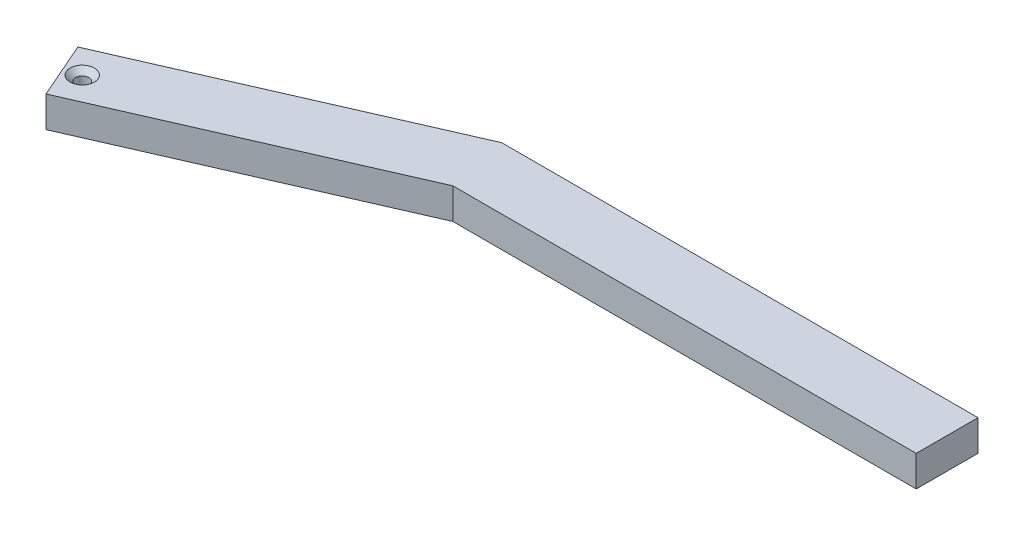
ISO-10303-21;
HEADER;
FILE_DESCRIPTION(('STEP AP214'),'2;1');
FILE_NAME('part.step','',(''),(''),'','','');
FILE_SCHEMA(('AUTOMOTIVE_DESIGN { 1 0 10303 214 1 1 1 1 }'));
ENDSEC;
DATA;
#1=APPLICATION_CONTEXT('core data for automotive mechanical design processes');
#2=APPLICATION_PROTOCOL_DEFINITION('international standard','automotive_design',2000,#1);
#3=PRODUCT_CONTEXT('',#1,'mechanical');
#4=PRODUCT('Part','Part','',(#3));
#5=PRODUCT_RELATED_PRODUCT_CATEGORY('part','',(#4));
#6=PRODUCT_DEFINITION_FORMATION('','',#4);
#7=PRODUCT_DEFINITION_CONTEXT('part definition',#1,'design');
#8=PRODUCT_DEFINITION('design','',#6,#7);
#9=PRODUCT_DEFINITION_SHAPE('','',#8);
#10=(LENGTH_UNIT() NAMED_UNIT(*) SI_UNIT(.MILLI.,.METRE.));
#11=(NAMED_UNIT(*) PLANE_ANGLE_UNIT() SI_UNIT($,.RADIAN.));
#12=(NAMED_UNIT(*) SI_UNIT($,.STERADIAN.) SOLID_ANGLE_UNIT());
#13=UNCERTAINTY_MEASURE_WITH_UNIT(LENGTH_MEASURE(1.E-05),#10,'distance_accuracy_value','');
#14=(GEOMETRIC_REPRESENTATION_CONTEXT(3) GLOBAL_UNCERTAINTY_ASSIGNED_CONTEXT((#13)) GLOBAL_UNIT_ASSIGNED_CONTEXT((#10,
#11,#12)) REPRESENTATION_CONTEXT('',''));
#15=CARTESIAN_POINT('',(0.,0.,0.));
#16=DIRECTION('',(0.,0.,1.));
#17=DIRECTION('',(1.,0.,0.));
#18=AXIS2_PLACEMENT_3D('',#15,#16,#17);
#19=CARTESIAN_POINT('',(20.3717259608542,25.4,46.5363597778754));
#20=DIRECTION('',(0.916070074367626,0.,-0.40101822757587));
#21=DIRECTION('',(-0.40101822757587,0.,-0.916070074367626));
#22=AXIS2_PLACEMENT_3D('',#19,#20,#21);
#23=PLANE('',#22);
#24=DIRECTION('',(0.40101822757587,0.,0.916070074367626));
#25=VECTOR('',#24,1.);
#26=CARTESIAN_POINT('',(20.3717259608542,0.,46.5363597778754));
#27=LINE('',#26,#25);
#28=CARTESIAN_POINT('',(0.,0.,0.));
#29=VERTEX_POINT('',#28);
#30=CARTESIAN_POINT('',(20.3717259608542,0.,46.5363597778754));
#31=VERTEX_POINT('',#30);
#32=EDGE_CURVE('E117',#29,#31,#27,.T.);
#33=ORIENTED_EDGE('',*,*,#32,.T.);
#34=DIRECTION('',(0.,-1.,0.));
#35=VECTOR('',#34,1.);
#36=CARTESIAN_POINT('',(20.3717259608542,25.4,46.5363597778754));
#37=LINE('',#36,#35);
#38=CARTESIAN_POINT('',(20.3717259608542,25.4,46.5363597778754));
#39=VERTEX_POINT('',#38);
#40=EDGE_CURVE('E11',#39,#31,#37,.T.);
#41=ORIENTED_EDGE('',*,*,#40,.F.);
#42=DIRECTION('',(0.40101822757587,0.,0.916070074367626));
#43=VECTOR('',#42,1.);
#44=CARTESIAN_POINT('',(20.3717259608542,25.4,46.5363597778754));
#45=LINE('',#44,#43);
#46=CARTESIAN_POINT('',(0.,25.4,0.));
#47=VERTEX_POINT('',#46);
#48=EDGE_CURVE('E128',#47,#39,#45,.T.);
#49=ORIENTED_EDGE('',*,*,#48,.F.);
#50=DIRECTION('',(0.,-1.,0.));
#51=VECTOR('',#50,1.);
#52=CARTESIAN_POINT('',(0.,25.4,0.));
#53=LINE('',#52,#51);
#54=EDGE_CURVE('E113',#47,#29,#53,.T.);
#55=ORIENTED_EDGE('',*,*,#54,.T.);
#56=EDGE_LOOP('',(#33,#41,#49,#55));
#57=FACE_BOUND('',#56,.T.);
#58=ADVANCED_FACE('F33',(#57),#23,.F.);
#59=CARTESIAN_POINT('',(253.053524850231,25.4,-55.3222700263955));
#60=DIRECTION('',(-0.40101822757587,0.,-0.916070074367626));
#61=DIRECTION('',(-0.916070074367626,0.,0.40101822757587));
#62=AXIS2_PLACEMENT_3D('',#59,#60,#61);
#63=PLANE('',#62);
#64=DIRECTION('',(0.916070074367626,0.,-0.40101822757587));
#65=VECTOR('',#64,1.);
#66=CARTESIAN_POINT('',(253.053524850231,0.,-55.3222700263955));
#67=LINE('',#66,#65);
#68=CARTESIAN_POINT('',(253.053524850231,0.,-55.3222700263955));
#69=VERTEX_POINT('',#68);
#70=EDGE_CURVE('E120',#31,#69,#67,.T.);
#71=ORIENTED_EDGE('',*,*,#70,.T.);
#72=DIRECTION('',(0.,-1.,0.));
#73=VECTOR('',#72,1.);
#74=CARTESIAN_POINT('',(253.053524850231,25.4,-55.3222700263955));
#75=LINE('',#74,#73);
#76=CARTESIAN_POINT('',(253.053524850231,25.4,-55.3222700263955));
#77=VERTEX_POINT('',#76);
#78=EDGE_CURVE('E41',#77,#69,#75,.T.);
#79=ORIENTED_EDGE('',*,*,#78,.F.);
#80=DIRECTION('',(0.916070074367626,0.,-0.40101822757587));
#81=VECTOR('',#80,1.);
#82=CARTESIAN_POINT('',(253.053524850231,25.4,-55.3222700263955));
#83=LINE('',#82,#81);
#84=EDGE_CURVE('E86',#39,#77,#83,.T.);
#85=ORIENTED_EDGE('',*,*,#84,.F.);
#86=ORIENTED_EDGE('',*,*,#40,.T.);
#87=EDGE_LOOP('',(#71,#79,#85,#86));
#88=FACE_BOUND('',#87,.T.);
#89=ADVANCED_FACE('F153',(#88),#63,.F.);
#90=CARTESIAN_POINT('',(634.053524850231,25.4,-55.3222700263956));
#91=DIRECTION('',(0.,0.,-1.));
#92=DIRECTION('',(-1.,0.,0.));
#93=AXIS2_PLACEMENT_3D('',#90,#91,#92);
#94=PLANE('',#93);
#95=DIRECTION('',(1.,0.,0.));
#96=VECTOR('',#95,1.);
#97=CARTESIAN_POINT('',(634.053524850231,0.,-55.3222700263956));
#98=LINE('',#97,#96);
#99=CARTESIAN_POINT('',(634.053524850231,0.,-55.3222700263956));
#100=VERTEX_POINT('',#99);
#101=EDGE_CURVE('E123',#69,#100,#98,.T.);
#102=ORIENTED_EDGE('',*,*,#101,.T.);
#103=DIRECTION('',(0.,-1.,0.));
#104=VECTOR('',#103,1.);
#105=CARTESIAN_POINT('',(634.053524850231,25.4,-55.3222700263956));
#106=LINE('',#105,#104);
#107=CARTESIAN_POINT('',(634.053524850231,25.4,-55.3222700263956));
#108=VERTEX_POINT('',#107);
#109=EDGE_CURVE('E108',#108,#100,#106,.T.);
#110=ORIENTED_EDGE('',*,*,#109,.F.);
#111=DIRECTION('',(1.,0.,0.));
#112=VECTOR('',#111,1.);
#113=CARTESIAN_POINT('',(634.053524850231,25.4,-55.3222700263956));
#114=LINE('',#113,#112);
#115=EDGE_CURVE('E99',#77,#108,#114,.T.);
#116=ORIENTED_EDGE('',*,*,#115,.F.);
#117=ORIENTED_EDGE('',*,*,#78,.T.);
#118=EDGE_LOOP('',(#102,#110,#116,#117));
#119=FACE_BOUND('',#118,.T.);
#120=ADVANCED_FACE('F134',(#119),#94,.F.);
#121=CARTESIAN_POINT('',(634.053524850231,25.4,-106.122270026396));
#122=DIRECTION('',(-1.,0.,0.));
#123=DIRECTION('',(0.,0.,1.));
#124=AXIS2_PLACEMENT_3D('',#121,#122,#123);
#125=PLANE('',#124);
#126=DIRECTION('',(0.,0.,-1.));
#127=VECTOR('',#126,1.);
#128=CARTESIAN_POINT('',(634.053524850231,0.,-106.122270026396));
#129=LINE('',#128,#127);
#130=CARTESIAN_POINT('',(634.053524850231,0.,-106.122270026396));
#131=VERTEX_POINT('',#130);
#132=EDGE_CURVE('E107',#100,#131,#129,.T.);
#133=ORIENTED_EDGE('',*,*,#132,.T.);
#134=DIRECTION('',(0.,-1.,0.));
#135=VECTOR('',#134,1.);
#136=CARTESIAN_POINT('',(634.053524850231,25.4,-106.122270026396));
#137=LINE('',#136,#135);
#138=CARTESIAN_POINT('',(634.053524850231,25.4,-106.122270026396));
#139=VERTEX_POINT('',#138);
#140=EDGE_CURVE('E104',#139,#131,#137,.T.);
#141=ORIENTED_EDGE('',*,*,#140,.F.);
#142=DIRECTION('',(0.,0.,-1.));
#143=VECTOR('',#142,1.);
#144=CARTESIAN_POINT('',(634.053524850231,25.4,-106.122270026396));
#145=LINE('',#144,#143);
#146=EDGE_CURVE('E93',#108,#139,#145,.T.);
#147=ORIENTED_EDGE('',*,*,#146,.F.);
#148=ORIENTED_EDGE('',*,*,#109,.T.);
#149=EDGE_LOOP('',(#133,#141,#147,#148));
#150=FACE_BOUND('',#149,.T.);
#151=ADVANCED_FACE('F105',(#150),#125,.F.);
#152=CARTESIAN_POINT('',(242.421488875463,25.4,-106.122270026396));
#153=DIRECTION('',(0.,0.,1.));
#154=DIRECTION('',(1.,0.,0.));
#155=AXIS2_PLACEMENT_3D('',#152,#153,#154);
#156=PLANE('',#155);
#157=DIRECTION('',(-1.,0.,0.));
#158=VECTOR('',#157,1.);
#159=CARTESIAN_POINT('',(242.421488875463,0.,-106.122270026396));
#160=LINE('',#159,#158);
#161=CARTESIAN_POINT('',(242.421488875463,0.,-106.122270026396));
#162=VERTEX_POINT('',#161);
#163=EDGE_CURVE('E72',#131,#162,#160,.T.);
#164=ORIENTED_EDGE('',*,*,#163,.T.);
#165=DIRECTION('',(0.,-1.,0.));
#166=VECTOR('',#165,1.);
#167=CARTESIAN_POINT('',(242.421488875463,25.4,-106.122270026396));
#168=LINE('',#167,#166);
#169=CARTESIAN_POINT('',(242.421488875463,25.4,-106.122270026396));
#170=VERTEX_POINT('',#169);
#171=EDGE_CURVE('E109',#170,#162,#168,.T.);
#172=ORIENTED_EDGE('',*,*,#171,.F.);
#173=DIRECTION('',(-1.,0.,0.));
#174=VECTOR('',#173,1.);
#175=CARTESIAN_POINT('',(242.421488875463,25.4,-106.122270026396));
#176=LINE('',#175,#174);
#177=EDGE_CURVE('E97',#139,#170,#176,.T.);
#178=ORIENTED_EDGE('',*,*,#177,.F.);
#179=ORIENTED_EDGE('',*,*,#140,.T.);
#180=EDGE_LOOP('',(#164,#172,#178,#179));
#181=FACE_BOUND('',#180,.T.);
#182=ADVANCED_FACE('F111',(#181),#156,.F.);
#183=CARTESIAN_POINT('',(0.,25.4,0.));
#184=DIRECTION('',(0.40101822757587,0.,0.916070074367626));
#185=DIRECTION('',(0.916070074367626,0.,-0.40101822757587));
#186=AXIS2_PLACEMENT_3D('',#183,#184,#185);
#187=PLANE('',#186);
#188=DIRECTION('',(-0.916070074367626,0.,0.40101822757587));
#189=VECTOR('',#188,1.);
#190=CARTESIAN_POINT('',(0.,0.,0.));
#191=LINE('',#190,#189);
#192=EDGE_CURVE('E78',#162,#29,#191,.T.);
#193=ORIENTED_EDGE('',*,*,#192,.T.);
#194=ORIENTED_EDGE('',*,*,#54,.F.);
#195=DIRECTION('',(-0.916070074367626,0.,0.40101822757587));
#196=VECTOR('',#195,1.);
#197=CARTESIAN_POINT('',(0.,25.4,0.));
#198=LINE('',#197,#196);
#199=EDGE_CURVE('E49',#170,#47,#198,.T.);
#200=ORIENTED_EDGE('',*,*,#199,.F.);
#201=ORIENTED_EDGE('',*,*,#171,.T.);
#202=EDGE_LOOP('',(#193,#194,#200,#201));
#203=FACE_BOUND('',#202,.T.);
#204=ADVANCED_FACE('F141',(#203),#187,.F.);
#205=CARTESIAN_POINT('',(0.,25.4,0.));
#206=DIRECTION('',(0.,-1.,0.));
#207=DIRECTION('',(0.,0.,-1.));
#208=AXIS2_PLACEMENT_3D('',#205,#206,#207);
#209=PLANE('',#208);
#210=CARTESIAN_POINT('',(21.8199529248959,25.4,18.1752483987242));
#211=DIRECTION('',(0.,1.,0.));
#212=DIRECTION('',(0.,0.,1.));
#213=AXIS2_PLACEMENT_3D('',#210,#211,#212);
#214=CIRCLE('',#213,10.);
#215=CARTESIAN_POINT('',(21.8199529248959,25.4,28.1752483987242));
#216=VERTEX_POINT('',#215);
#217=EDGE_CURVE('E219',#216,#216,#214,.T.);
#218=ORIENTED_EDGE('',*,*,#217,.F.);
#219=EDGE_LOOP('',(#218));
#220=FACE_BOUND('',#219,.T.);
#221=ORIENTED_EDGE('',*,*,#48,.T.);
#222=ORIENTED_EDGE('',*,*,#84,.T.);
#223=ORIENTED_EDGE('',*,*,#115,.T.);
#224=ORIENTED_EDGE('',*,*,#146,.T.);
#225=ORIENTED_EDGE('',*,*,#177,.T.);
#226=ORIENTED_EDGE('',*,*,#199,.T.);
#227=EDGE_LOOP('',(#221,#222,#223,#224,#225,#226));
#228=FACE_BOUND('',#227,.T.);
#229=ADVANCED_FACE('F95',(#220,#228),#209,.F.);
#230=CARTESIAN_POINT('',(0.,0.,0.));
#231=DIRECTION('',(0.,-1.,0.));
#232=DIRECTION('',(0.,0.,-1.));
#233=AXIS2_PLACEMENT_3D('',#230,#231,#232);
#234=PLANE('',#233);
#235=CARTESIAN_POINT('',(21.8199529248959,0.,18.1752483987242));
#236=DIRECTION('',(0.,1.,0.));
#237=DIRECTION('',(0.,0.,1.));
#238=AXIS2_PLACEMENT_3D('',#235,#236,#237);
#239=CIRCLE('',#238,5.49999999999999);
#240=CARTESIAN_POINT('',(21.8199529248959,0.,23.6752483987242));
#241=VERTEX_POINT('',#240);
#242=EDGE_CURVE('E121',#241,#241,#239,.T.);
#243=ORIENTED_EDGE('',*,*,#242,.T.);
#244=EDGE_LOOP('',(#243));
#245=FACE_BOUND('',#244,.T.);
#246=ORIENTED_EDGE('',*,*,#32,.F.);
#247=ORIENTED_EDGE('',*,*,#192,.F.);
#248=ORIENTED_EDGE('',*,*,#163,.F.);
#249=ORIENTED_EDGE('',*,*,#132,.F.);
#250=ORIENTED_EDGE('',*,*,#101,.F.);
#251=ORIENTED_EDGE('',*,*,#70,.F.);
#252=EDGE_LOOP('',(#246,#247,#248,#249,#250,#251));
#253=FACE_BOUND('',#252,.T.);
#254=ADVANCED_FACE('F137',(#245,#253),#234,.T.);
#255=CARTESIAN_POINT('',(21.8199529248959,25.4,18.1752483987242));
#256=DIRECTION('',(0.,1.,0.));
#257=DIRECTION('',(0.,0.,1.));
#258=AXIS2_PLACEMENT_3D('',#255,#256,#257);
#259=CYLINDRICAL_SURFACE('',#258,5.5);
#260=ORIENTED_EDGE('',*,*,#242,.F.);
#261=EDGE_LOOP('',(#260));
#262=FACE_BOUND('',#261,.T.);
#263=CARTESIAN_POINT('',(21.8199529248959,20.9,18.1752483987242));
#264=DIRECTION('',(0.,1.,0.));
#265=DIRECTION('',(0.,0.,1.));
#266=AXIS2_PLACEMENT_3D('',#263,#264,#265);
#267=CIRCLE('',#266,5.5);
#268=CARTESIAN_POINT('',(21.8199529248959,20.9,23.6752483987242));
#269=VERTEX_POINT('',#268);
#270=EDGE_CURVE('E216',#269,#269,#267,.T.);
#271=ORIENTED_EDGE('',*,*,#270,.T.);
#272=EDGE_LOOP('',(#271));
#273=FACE_BOUND('',#272,.T.);
#274=ADVANCED_FACE('F190',(#262,#273),#259,.F.);
#275=CARTESIAN_POINT('',(21.8199529248959,25.4,18.1752483987242));
#276=DIRECTION('',(0.,1.,0.));
#277=DIRECTION('',(0.,0.,1.));
#278=AXIS2_PLACEMENT_3D('',#275,#276,#277);
#279=CONICAL_SURFACE('',#278,10.,0.785398163397449);
#280=ORIENTED_EDGE('',*,*,#270,.F.);
#281=EDGE_LOOP('',(#280));
#282=FACE_BOUND('',#281,.T.);
#283=ORIENTED_EDGE('',*,*,#217,.T.);
#284=EDGE_LOOP('',(#283));
#285=FACE_BOUND('',#284,.T.);
#286=ADVANCED_FACE('F199',(#282,#285),#279,.F.);
#287=CLOSED_SHELL('',(#58,#89,#120,#151,#182,#204,#229,#254,#274,#286));
#288=MANIFOLD_SOLID_BREP('B2',#287);
#289=ADVANCED_BREP_SHAPE_REPRESENTATION('',(#18,#288),#14);
#290=SHAPE_DEFINITION_REPRESENTATION(#9,#289);
ENDSEC;
END-ISO-10303-21;
